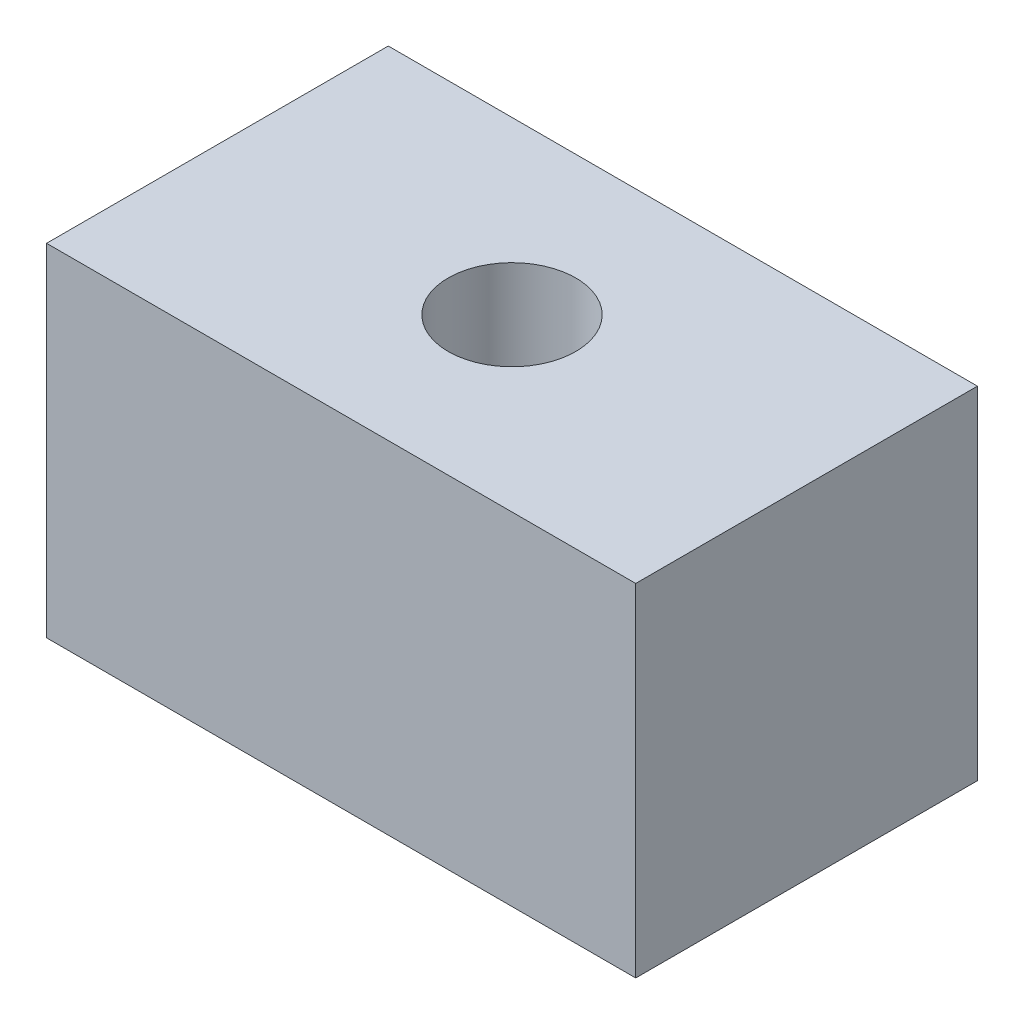
ISO-10303-21;
HEADER;
FILE_DESCRIPTION(('STEP AP214'),'2;1');
FILE_NAME('part.step','',(''),(''),'','','');
FILE_SCHEMA(('AUTOMOTIVE_DESIGN { 1 0 10303 214 1 1 1 1 }'));
ENDSEC;
DATA;
#1=APPLICATION_CONTEXT('core data for automotive mechanical design processes');
#2=APPLICATION_PROTOCOL_DEFINITION('international standard','automotive_design',2000,#1);
#3=PRODUCT_CONTEXT('',#1,'mechanical');
#4=PRODUCT('Part','Part','',(#3));
#5=PRODUCT_RELATED_PRODUCT_CATEGORY('part','',(#4));
#6=PRODUCT_DEFINITION_FORMATION('','',#4);
#7=PRODUCT_DEFINITION_CONTEXT('part definition',#1,'design');
#8=PRODUCT_DEFINITION('design','',#6,#7);
#9=PRODUCT_DEFINITION_SHAPE('','',#8);
#10=(LENGTH_UNIT() NAMED_UNIT(*) SI_UNIT(.MILLI.,.METRE.));
#11=(NAMED_UNIT(*) PLANE_ANGLE_UNIT() SI_UNIT($,.RADIAN.));
#12=(NAMED_UNIT(*) SI_UNIT($,.STERADIAN.) SOLID_ANGLE_UNIT());
#13=UNCERTAINTY_MEASURE_WITH_UNIT(LENGTH_MEASURE(1.E-05),#10,'distance_accuracy_value','');
#14=(GEOMETRIC_REPRESENTATION_CONTEXT(3) GLOBAL_UNCERTAINTY_ASSIGNED_CONTEXT((#13)) GLOBAL_UNIT_ASSIGNED_CONTEXT((#10,
#11,#12)) REPRESENTATION_CONTEXT('',''));
#15=CARTESIAN_POINT('',(0.,0.,0.));
#16=DIRECTION('',(0.,0.,1.));
#17=DIRECTION('',(1.,0.,0.));
#18=AXIS2_PLACEMENT_3D('',#15,#16,#17);
#19=CARTESIAN_POINT('',(25.4,7.366,-7.366));
#20=DIRECTION('',(0.,0.,1.));
#21=DIRECTION('',(0.,-1.,0.));
#22=AXIS2_PLACEMENT_3D('',#19,#20,#21);
#23=PLANE('',#22);
#24=DIRECTION('',(0.,1.,0.));
#25=VECTOR('',#24,1.);
#26=CARTESIAN_POINT('',(0.,7.366,-7.366));
#27=LINE('',#26,#25);
#28=CARTESIAN_POINT('',(0.,-7.366,-7.366));
#29=VERTEX_POINT('',#28);
#30=CARTESIAN_POINT('',(0.,-3.492,-7.366));
#31=VERTEX_POINT('',#30);
#32=EDGE_CURVE('E160',#29,#31,#27,.T.);
#33=ORIENTED_EDGE('',*,*,#32,.T.);
#34=DIRECTION('',(-1.,0.,0.));
#35=VECTOR('',#34,1.);
#36=CARTESIAN_POINT('',(0.,-3.492,-7.366));
#37=LINE('',#36,#35);
#38=CARTESIAN_POINT('',(9.20625,-3.492,-7.366));
#39=VERTEX_POINT('',#38);
#40=EDGE_CURVE('E131',#39,#31,#37,.T.);
#41=ORIENTED_EDGE('',*,*,#40,.F.);
#42=CARTESIAN_POINT('',(9.20625,-2.69825,-7.366));
#43=DIRECTION('',(0.,0.,1.));
#44=DIRECTION('',(0.,-1.,0.));
#45=AXIS2_PLACEMENT_3D('',#42,#43,#44);
#46=CIRCLE('',#45,0.79375);
#47=CARTESIAN_POINT('',(10.,-2.69825,-7.366));
#48=VERTEX_POINT('',#47);
#49=EDGE_CURVE('E11',#39,#48,#46,.T.);
#50=ORIENTED_EDGE('',*,*,#49,.T.);
#51=DIRECTION('',(0.,-1.,0.));
#52=VECTOR('',#51,1.);
#53=CARTESIAN_POINT('',(10.,3.366,-7.366));
#54=LINE('',#53,#52);
#55=CARTESIAN_POINT('',(10.,2.57225,-7.366));
#56=VERTEX_POINT('',#55);
#57=EDGE_CURVE('E193',#56,#48,#54,.T.);
#58=ORIENTED_EDGE('',*,*,#57,.F.);
#59=CARTESIAN_POINT('',(9.20625,2.57225,-7.366));
#60=DIRECTION('',(0.,0.,1.));
#61=DIRECTION('',(0.,-1.,0.));
#62=AXIS2_PLACEMENT_3D('',#59,#60,#61);
#63=CIRCLE('',#62,0.79375);
#64=CARTESIAN_POINT('',(9.20625,3.366,-7.366));
#65=VERTEX_POINT('',#64);
#66=EDGE_CURVE('E44',#56,#65,#63,.T.);
#67=ORIENTED_EDGE('',*,*,#66,.T.);
#68=DIRECTION('',(1.,0.,0.));
#69=VECTOR('',#68,1.);
#70=CARTESIAN_POINT('',(0.,3.366,-7.366));
#71=LINE('',#70,#69);
#72=CARTESIAN_POINT('',(0.,3.366,-7.366));
#73=VERTEX_POINT('',#72);
#74=EDGE_CURVE('E191',#73,#65,#71,.T.);
#75=ORIENTED_EDGE('',*,*,#74,.F.);
#76=CARTESIAN_POINT('',(0.,7.366,-7.366));
#77=VERTEX_POINT('',#76);
#78=EDGE_CURVE('E136',#73,#77,#27,.T.);
#79=ORIENTED_EDGE('',*,*,#78,.T.);
#80=DIRECTION('',(-1.,0.,0.));
#81=VECTOR('',#80,1.);
#82=CARTESIAN_POINT('',(25.4,7.366,-7.366));
#83=LINE('',#82,#81);
#84=CARTESIAN_POINT('',(25.4,7.366,-7.366));
#85=VERTEX_POINT('',#84);
#86=EDGE_CURVE('E176',#85,#77,#83,.T.);
#87=ORIENTED_EDGE('',*,*,#86,.F.);
#88=DIRECTION('',(0.,1.,0.));
#89=VECTOR('',#88,1.);
#90=CARTESIAN_POINT('',(25.4,7.366,-7.366));
#91=LINE('',#90,#89);
#92=CARTESIAN_POINT('',(25.4,-7.366,-7.366));
#93=VERTEX_POINT('',#92);
#94=EDGE_CURVE('E149',#93,#85,#91,.T.);
#95=ORIENTED_EDGE('',*,*,#94,.F.);
#96=DIRECTION('',(-1.,0.,0.));
#97=VECTOR('',#96,1.);
#98=CARTESIAN_POINT('',(25.4,-7.366,-7.366));
#99=LINE('',#98,#97);
#100=EDGE_CURVE('E159',#93,#29,#99,.T.);
#101=ORIENTED_EDGE('',*,*,#100,.T.);
#102=EDGE_LOOP('',(#33,#41,#50,#58,#67,#75,#79,#87,#95,#101));
#103=FACE_BOUND('',#102,.T.);
#104=ADVANCED_FACE('F36',(#103),#23,.F.);
#105=CARTESIAN_POINT('',(25.4,7.366,7.366));
#106=DIRECTION('',(0.,-1.,0.));
#107=DIRECTION('',(0.,0.,-1.));
#108=AXIS2_PLACEMENT_3D('',#105,#106,#107);
#109=PLANE('',#108);
#110=CARTESIAN_POINT('',(12.7,7.366,0.));
#111=DIRECTION('',(0.,1.,0.));
#112=DIRECTION('',(0.,0.,1.));
#113=AXIS2_PLACEMENT_3D('',#110,#111,#112);
#114=CIRCLE('',#113,2.75);
#115=CARTESIAN_POINT('',(12.7,7.366,2.75));
#116=VERTEX_POINT('',#115);
#117=EDGE_CURVE('E139',#116,#116,#114,.T.);
#118=ORIENTED_EDGE('',*,*,#117,.F.);
#119=EDGE_LOOP('',(#118));
#120=FACE_BOUND('',#119,.T.);
#121=DIRECTION('',(0.,0.,1.));
#122=VECTOR('',#121,1.);
#123=CARTESIAN_POINT('',(0.,7.366,7.366));
#124=LINE('',#123,#122);
#125=CARTESIAN_POINT('',(0.,7.366,7.366));
#126=VERTEX_POINT('',#125);
#127=EDGE_CURVE('E163',#77,#126,#124,.T.);
#128=ORIENTED_EDGE('',*,*,#127,.T.);
#129=DIRECTION('',(-1.,0.,0.));
#130=VECTOR('',#129,1.);
#131=CARTESIAN_POINT('',(25.4,7.366,7.366));
#132=LINE('',#131,#130);
#133=CARTESIAN_POINT('',(25.4,7.366,7.366));
#134=VERTEX_POINT('',#133);
#135=EDGE_CURVE('E173',#134,#126,#132,.T.);
#136=ORIENTED_EDGE('',*,*,#135,.F.);
#137=DIRECTION('',(0.,0.,1.));
#138=VECTOR('',#137,1.);
#139=CARTESIAN_POINT('',(25.4,7.366,7.366));
#140=LINE('',#139,#138);
#141=EDGE_CURVE('E152',#85,#134,#140,.T.);
#142=ORIENTED_EDGE('',*,*,#141,.F.);
#143=ORIENTED_EDGE('',*,*,#86,.T.);
#144=EDGE_LOOP('',(#128,#136,#142,#143));
#145=FACE_BOUND('',#144,.T.);
#146=ADVANCED_FACE('F222',(#120,#145),#109,.F.);
#147=CARTESIAN_POINT('',(25.4,7.366,7.366));
#148=DIRECTION('',(0.,0.,-1.));
#149=DIRECTION('',(0.,1.,0.));
#150=AXIS2_PLACEMENT_3D('',#147,#148,#149);
#151=PLANE('',#150);
#152=DIRECTION('',(0.,-1.,0.));
#153=VECTOR('',#152,1.);
#154=CARTESIAN_POINT('',(0.,7.366,7.366));
#155=LINE('',#154,#153);
#156=CARTESIAN_POINT('',(0.,-7.366,7.366));
#157=VERTEX_POINT('',#156);
#158=EDGE_CURVE('E165',#126,#157,#155,.T.);
#159=ORIENTED_EDGE('',*,*,#158,.T.);
#160=DIRECTION('',(-1.,0.,0.));
#161=VECTOR('',#160,1.);
#162=CARTESIAN_POINT('',(25.4,-7.366,7.366));
#163=LINE('',#162,#161);
#164=CARTESIAN_POINT('',(25.4,-7.366,7.366));
#165=VERTEX_POINT('',#164);
#166=EDGE_CURVE('E170',#165,#157,#163,.T.);
#167=ORIENTED_EDGE('',*,*,#166,.F.);
#168=DIRECTION('',(0.,-1.,0.));
#169=VECTOR('',#168,1.);
#170=CARTESIAN_POINT('',(25.4,7.366,7.366));
#171=LINE('',#170,#169);
#172=EDGE_CURVE('E155',#134,#165,#171,.T.);
#173=ORIENTED_EDGE('',*,*,#172,.F.);
#174=ORIENTED_EDGE('',*,*,#135,.T.);
#175=EDGE_LOOP('',(#159,#167,#173,#174));
#176=FACE_BOUND('',#175,.T.);
#177=ADVANCED_FACE('F218',(#176),#151,.F.);
#178=CARTESIAN_POINT('',(25.4,-7.366,7.366));
#179=DIRECTION('',(0.,1.,0.));
#180=DIRECTION('',(0.,0.,1.));
#181=AXIS2_PLACEMENT_3D('',#178,#179,#180);
#182=PLANE('',#181);
#183=CARTESIAN_POINT('',(12.7,-7.366,0.));
#184=DIRECTION('',(0.,1.,0.));
#185=DIRECTION('',(0.,0.,1.));
#186=AXIS2_PLACEMENT_3D('',#183,#184,#185);
#187=CIRCLE('',#186,2.75);
#188=CARTESIAN_POINT('',(12.7,-7.366,2.75));
#189=VERTEX_POINT('',#188);
#190=EDGE_CURVE('E144',#189,#189,#187,.T.);
#191=ORIENTED_EDGE('',*,*,#190,.T.);
#192=EDGE_LOOP('',(#191));
#193=FACE_BOUND('',#192,.T.);
#194=DIRECTION('',(0.,0.,-1.));
#195=VECTOR('',#194,1.);
#196=CARTESIAN_POINT('',(0.,-7.366,7.366));
#197=LINE('',#196,#195);
#198=EDGE_CURVE('E153',#157,#29,#197,.T.);
#199=ORIENTED_EDGE('',*,*,#198,.T.);
#200=ORIENTED_EDGE('',*,*,#100,.F.);
#201=DIRECTION('',(0.,0.,-1.));
#202=VECTOR('',#201,1.);
#203=CARTESIAN_POINT('',(25.4,-7.366,7.366));
#204=LINE('',#203,#202);
#205=EDGE_CURVE('E157',#165,#93,#204,.T.);
#206=ORIENTED_EDGE('',*,*,#205,.F.);
#207=ORIENTED_EDGE('',*,*,#166,.T.);
#208=EDGE_LOOP('',(#199,#200,#206,#207));
#209=FACE_BOUND('',#208,.T.);
#210=ADVANCED_FACE('F214',(#193,#209),#182,.F.);
#211=CARTESIAN_POINT('',(25.4,0.,0.));
#212=DIRECTION('',(1.,0.,0.));
#213=DIRECTION('',(0.,0.,-1.));
#214=AXIS2_PLACEMENT_3D('',#211,#212,#213);
#215=PLANE('',#214);
#216=ORIENTED_EDGE('',*,*,#94,.T.);
#217=ORIENTED_EDGE('',*,*,#141,.T.);
#218=ORIENTED_EDGE('',*,*,#172,.T.);
#219=ORIENTED_EDGE('',*,*,#205,.T.);
#220=EDGE_LOOP('',(#216,#217,#218,#219));
#221=FACE_BOUND('',#220,.T.);
#222=ADVANCED_FACE('F224',(#221),#215,.T.);
#223=CARTESIAN_POINT('',(0.,0.,0.));
#224=DIRECTION('',(1.,0.,0.));
#225=DIRECTION('',(0.,0.,-1.));
#226=AXIS2_PLACEMENT_3D('',#223,#224,#225);
#227=PLANE('',#226);
#228=DIRECTION('',(0.,1.,0.));
#229=VECTOR('',#228,1.);
#230=CARTESIAN_POINT('',(0.,3.366,-5.588));
#231=LINE('',#230,#229);
#232=CARTESIAN_POINT('',(0.,-3.492,-5.588));
#233=VERTEX_POINT('',#232);
#234=CARTESIAN_POINT('',(0.,3.366,-5.588));
#235=VERTEX_POINT('',#234);
#236=EDGE_CURVE('E123',#233,#235,#231,.T.);
#237=ORIENTED_EDGE('',*,*,#236,.F.);
#238=DIRECTION('',(0.,0.,-1.));
#239=VECTOR('',#238,1.);
#240=CARTESIAN_POINT('',(0.,-3.492,-5.588));
#241=LINE('',#240,#239);
#242=EDGE_CURVE('E137',#233,#31,#241,.T.);
#243=ORIENTED_EDGE('',*,*,#242,.T.);
#244=ORIENTED_EDGE('',*,*,#32,.F.);
#245=ORIENTED_EDGE('',*,*,#198,.F.);
#246=ORIENTED_EDGE('',*,*,#158,.F.);
#247=ORIENTED_EDGE('',*,*,#127,.F.);
#248=ORIENTED_EDGE('',*,*,#78,.F.);
#249=DIRECTION('',(0.,0.,-1.));
#250=VECTOR('',#249,1.);
#251=CARTESIAN_POINT('',(0.,3.366,-5.588));
#252=LINE('',#251,#250);
#253=EDGE_CURVE('E117',#235,#73,#252,.T.);
#254=ORIENTED_EDGE('',*,*,#253,.F.);
#255=EDGE_LOOP('',(#237,#243,#244,#245,#246,#247,#248,#254));
#256=FACE_BOUND('',#255,.T.);
#257=ADVANCED_FACE('F134',(#256),#227,.F.);
#258=CARTESIAN_POINT('',(12.7,-7.366,0.));
#259=DIRECTION('',(0.,1.,0.));
#260=DIRECTION('',(0.,0.,1.));
#261=AXIS2_PLACEMENT_3D('',#258,#259,#260);
#262=CYLINDRICAL_SURFACE('',#261,2.75);
#263=ORIENTED_EDGE('',*,*,#190,.F.);
#264=EDGE_LOOP('',(#263));
#265=FACE_BOUND('',#264,.T.);
#266=ORIENTED_EDGE('',*,*,#117,.T.);
#267=EDGE_LOOP('',(#266));
#268=FACE_BOUND('',#267,.T.);
#269=ADVANCED_FACE('F231',(#265,#268),#262,.F.);
#270=CARTESIAN_POINT('',(0.,-3.492,-5.588));
#271=DIRECTION('',(0.,-1.,0.));
#272=DIRECTION('',(0.,0.,-1.));
#273=AXIS2_PLACEMENT_3D('',#270,#271,#272);
#274=PLANE('',#273);
#275=DIRECTION('',(-1.,0.,0.));
#276=VECTOR('',#275,1.);
#277=CARTESIAN_POINT('',(0.,-3.492,-5.588));
#278=LINE('',#277,#276);
#279=CARTESIAN_POINT('',(9.20625,-3.492,-5.588));
#280=VERTEX_POINT('',#279);
#281=EDGE_CURVE('E127',#280,#233,#278,.T.);
#282=ORIENTED_EDGE('',*,*,#281,.F.);
#283=DIRECTION('',(0.,0.,-1.));
#284=VECTOR('',#283,1.);
#285=CARTESIAN_POINT('',(9.20625,-3.492,-7.366));
#286=LINE('',#285,#284);
#287=EDGE_CURVE('E188',#280,#39,#286,.T.);
#288=ORIENTED_EDGE('',*,*,#287,.T.);
#289=ORIENTED_EDGE('',*,*,#40,.T.);
#290=ORIENTED_EDGE('',*,*,#242,.F.);
#291=EDGE_LOOP('',(#282,#288,#289,#290));
#292=FACE_BOUND('',#291,.T.);
#293=ADVANCED_FACE('F206',(#292),#274,.F.);
#294=CARTESIAN_POINT('',(10.,3.366,-5.588));
#295=DIRECTION('',(1.,0.,0.));
#296=DIRECTION('',(0.,1.,0.));
#297=AXIS2_PLACEMENT_3D('',#294,#295,#296);
#298=PLANE('',#297);
#299=DIRECTION('',(0.,-1.,0.));
#300=VECTOR('',#299,1.);
#301=CARTESIAN_POINT('',(10.,3.366,-5.588));
#302=LINE('',#301,#300);
#303=CARTESIAN_POINT('',(10.,2.57225,-5.588));
#304=VERTEX_POINT('',#303);
#305=CARTESIAN_POINT('',(10.,-2.69825,-5.588));
#306=VERTEX_POINT('',#305);
#307=EDGE_CURVE('E122',#304,#306,#302,.T.);
#308=ORIENTED_EDGE('',*,*,#307,.F.);
#309=DIRECTION('',(0.,0.,-1.));
#310=VECTOR('',#309,1.);
#311=CARTESIAN_POINT('',(10.,2.57225,-7.366));
#312=LINE('',#311,#310);
#313=EDGE_CURVE('E181',#304,#56,#312,.T.);
#314=ORIENTED_EDGE('',*,*,#313,.T.);
#315=ORIENTED_EDGE('',*,*,#57,.T.);
#316=DIRECTION('',(0.,0.,-1.));
#317=VECTOR('',#316,1.);
#318=CARTESIAN_POINT('',(10.,-2.69825,-5.588));
#319=LINE('',#318,#317);
#320=EDGE_CURVE('E179',#48,#306,#319,.F.);
#321=ORIENTED_EDGE('',*,*,#320,.T.);
#322=EDGE_LOOP('',(#308,#314,#315,#321));
#323=FACE_BOUND('',#322,.T.);
#324=ADVANCED_FACE('F201',(#323),#298,.F.);
#325=CARTESIAN_POINT('',(0.,3.366,-5.588));
#326=DIRECTION('',(0.,1.,0.));
#327=DIRECTION('',(0.,0.,1.));
#328=AXIS2_PLACEMENT_3D('',#325,#326,#327);
#329=PLANE('',#328);
#330=ORIENTED_EDGE('',*,*,#74,.T.);
#331=DIRECTION('',(0.,0.,-1.));
#332=VECTOR('',#331,1.);
#333=CARTESIAN_POINT('',(9.20625,3.366,-5.588));
#334=LINE('',#333,#332);
#335=CARTESIAN_POINT('',(9.20625,3.366,-5.588));
#336=VERTEX_POINT('',#335);
#337=EDGE_CURVE('E120',#65,#336,#334,.F.);
#338=ORIENTED_EDGE('',*,*,#337,.T.);
#339=DIRECTION('',(1.,0.,0.));
#340=VECTOR('',#339,1.);
#341=CARTESIAN_POINT('',(0.,3.366,-5.588));
#342=LINE('',#341,#340);
#343=EDGE_CURVE('E112',#235,#336,#342,.T.);
#344=ORIENTED_EDGE('',*,*,#343,.F.);
#345=ORIENTED_EDGE('',*,*,#253,.T.);
#346=EDGE_LOOP('',(#330,#338,#344,#345));
#347=FACE_BOUND('',#346,.T.);
#348=ADVANCED_FACE('F115',(#347),#329,.F.);
#349=CARTESIAN_POINT('',(0.,0.,-5.588));
#350=DIRECTION('',(0.,0.,1.));
#351=DIRECTION('',(0.,-1.,0.));
#352=AXIS2_PLACEMENT_3D('',#349,#350,#351);
#353=PLANE('',#352);
#354=CARTESIAN_POINT('',(4.92,-0.0630000000000009,-5.588));
#355=DIRECTION('',(0.,0.,-1.));
#356=DIRECTION('',(0.,1.,0.));
#357=AXIS2_PLACEMENT_3D('',#354,#355,#356);
#358=CIRCLE('',#357,1.5875);
#359=CARTESIAN_POINT('',(4.92,1.5245,-5.588));
#360=VERTEX_POINT('',#359);
#361=EDGE_CURVE('E196',#360,#360,#358,.T.);
#362=ORIENTED_EDGE('',*,*,#361,.F.);
#363=EDGE_LOOP('',(#362));
#364=FACE_BOUND('',#363,.T.);
#365=ORIENTED_EDGE('',*,*,#343,.T.);
#366=CARTESIAN_POINT('',(9.20625,2.57225,-5.588));
#367=DIRECTION('',(0.,0.,1.));
#368=DIRECTION('',(0.,-1.,0.));
#369=AXIS2_PLACEMENT_3D('',#366,#367,#368);
#370=CIRCLE('',#369,0.79375);
#371=EDGE_CURVE('E186',#336,#304,#370,.F.);
#372=ORIENTED_EDGE('',*,*,#371,.T.);
#373=ORIENTED_EDGE('',*,*,#307,.T.);
#374=CARTESIAN_POINT('',(9.20625,-2.69825,-5.588));
#375=DIRECTION('',(0.,0.,1.));
#376=DIRECTION('',(0.,-1.,0.));
#377=AXIS2_PLACEMENT_3D('',#374,#375,#376);
#378=CIRCLE('',#377,0.79375);
#379=EDGE_CURVE('E57',#306,#280,#378,.F.);
#380=ORIENTED_EDGE('',*,*,#379,.T.);
#381=ORIENTED_EDGE('',*,*,#281,.T.);
#382=ORIENTED_EDGE('',*,*,#236,.T.);
#383=EDGE_LOOP('',(#365,#372,#373,#380,#381,#382));
#384=FACE_BOUND('',#383,.T.);
#385=ADVANCED_FACE('F126',(#364,#384),#353,.F.);
#386=CARTESIAN_POINT('',(4.92,-0.0630000000000009,-5.588));
#387=DIRECTION('',(0.,0.,-1.));
#388=DIRECTION('',(0.,1.,0.));
#389=AXIS2_PLACEMENT_3D('',#386,#387,#388);
#390=CYLINDRICAL_SURFACE('',#389,1.5875);
#391=ORIENTED_EDGE('',*,*,#361,.T.);
#392=EDGE_LOOP('',(#391));
#393=FACE_BOUND('',#392,.T.);
#394=CARTESIAN_POINT('',(4.92,-0.0630000000000006,-7.366));
#395=DIRECTION('',(0.,0.,-1.));
#396=DIRECTION('',(0.,1.,0.));
#397=AXIS2_PLACEMENT_3D('',#394,#395,#396);
#398=CIRCLE('',#397,1.5875);
#399=CARTESIAN_POINT('',(4.92,1.5245,-7.366));
#400=VERTEX_POINT('',#399);
#401=EDGE_CURVE('E256',#400,#400,#398,.T.);
#402=ORIENTED_EDGE('',*,*,#401,.F.);
#403=EDGE_LOOP('',(#402));
#404=FACE_BOUND('',#403,.T.);
#405=ADVANCED_FACE('F246',(#393,#404),#390,.T.);
#406=ORIENTED_EDGE('',*,*,#401,.T.);
#407=EDGE_LOOP('',(#406));
#408=FACE_BOUND('',#407,.T.);
#409=ADVANCED_FACE('F238',(#408),#23,.F.);
#410=CARTESIAN_POINT('',(9.20625,2.57225,-5.588));
#411=DIRECTION('',(0.,0.,1.));
#412=DIRECTION('',(0.,-1.,0.));
#413=AXIS2_PLACEMENT_3D('',#410,#411,#412);
#414=CYLINDRICAL_SURFACE('',#413,0.79375);
#415=ORIENTED_EDGE('',*,*,#371,.F.);
#416=ORIENTED_EDGE('',*,*,#337,.F.);
#417=ORIENTED_EDGE('',*,*,#66,.F.);
#418=ORIENTED_EDGE('',*,*,#313,.F.);
#419=EDGE_LOOP('',(#415,#416,#417,#418));
#420=FACE_BOUND('',#419,.T.);
#421=ADVANCED_FACE('F198',(#420),#414,.F.);
#422=CARTESIAN_POINT('',(9.20625,-2.69825,-5.588));
#423=DIRECTION('',(0.,0.,1.));
#424=DIRECTION('',(0.,-1.,0.));
#425=AXIS2_PLACEMENT_3D('',#422,#423,#424);
#426=CYLINDRICAL_SURFACE('',#425,0.79375);
#427=ORIENTED_EDGE('',*,*,#379,.F.);
#428=ORIENTED_EDGE('',*,*,#320,.F.);
#429=ORIENTED_EDGE('',*,*,#49,.F.);
#430=ORIENTED_EDGE('',*,*,#287,.F.);
#431=EDGE_LOOP('',(#427,#428,#429,#430));
#432=FACE_BOUND('',#431,.T.);
#433=ADVANCED_FACE('F38',(#432),#426,.F.);
#434=CLOSED_SHELL('',(#104,#146,#177,#210,#222,#257,#269,#293,#324,#348,#385,#405,#409,#421,#433));
#435=MANIFOLD_SOLID_BREP('B2',#434);
#436=ADVANCED_BREP_SHAPE_REPRESENTATION('',(#18,#435),#14);
#437=SHAPE_DEFINITION_REPRESENTATION(#9,#436);
ENDSEC;
END-ISO-10303-21;
